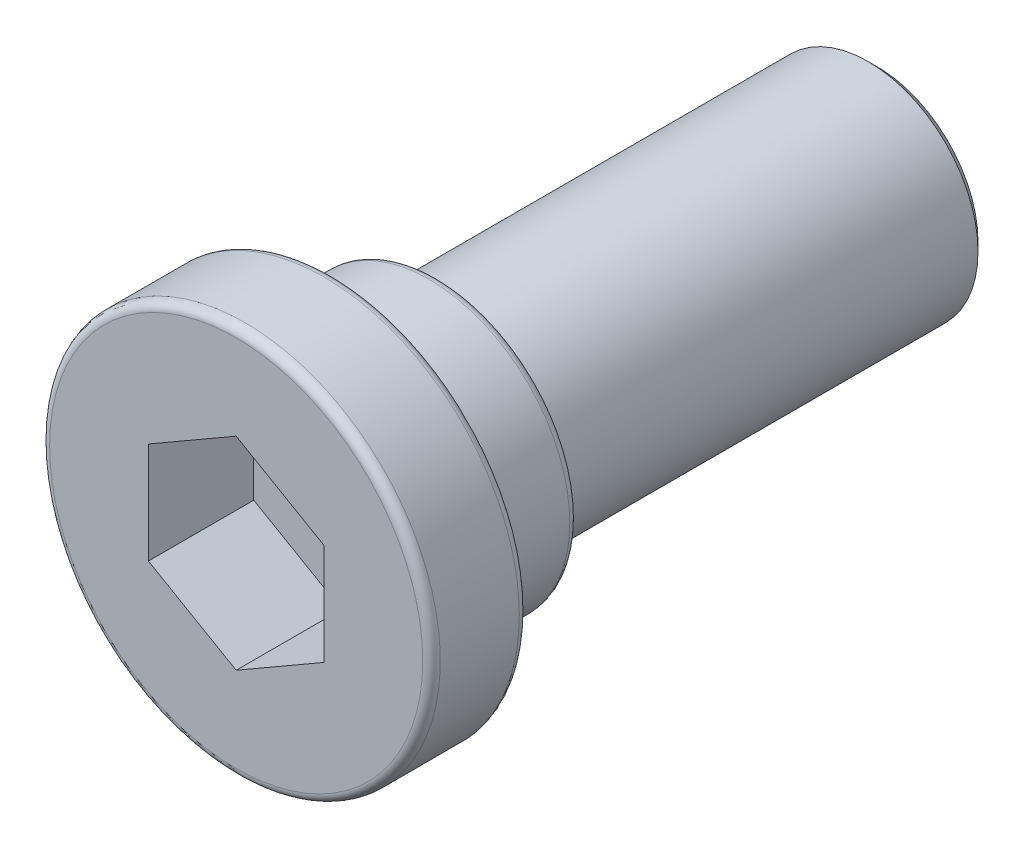
ISO-10303-21;
HEADER;
FILE_DESCRIPTION(('STEP AP214'),'2;1');
FILE_NAME('part.step','',(''),(''),'','','');
FILE_SCHEMA(('AUTOMOTIVE_DESIGN { 1 0 10303 214 1 1 1 1 }'));
ENDSEC;
DATA;
#1=APPLICATION_CONTEXT('core data for automotive mechanical design processes');
#2=APPLICATION_PROTOCOL_DEFINITION('international standard','automotive_design',2000,#1);
#3=PRODUCT_CONTEXT('',#1,'mechanical');
#4=PRODUCT('Part','Part','',(#3));
#5=PRODUCT_RELATED_PRODUCT_CATEGORY('part','',(#4));
#6=PRODUCT_DEFINITION_FORMATION('','',#4);
#7=PRODUCT_DEFINITION_CONTEXT('part definition',#1,'design');
#8=PRODUCT_DEFINITION('design','',#6,#7);
#9=PRODUCT_DEFINITION_SHAPE('','',#8);
#10=(LENGTH_UNIT() NAMED_UNIT(*) SI_UNIT(.MILLI.,.METRE.));
#11=(NAMED_UNIT(*) PLANE_ANGLE_UNIT() SI_UNIT($,.RADIAN.));
#12=(NAMED_UNIT(*) SI_UNIT($,.STERADIAN.) SOLID_ANGLE_UNIT());
#13=UNCERTAINTY_MEASURE_WITH_UNIT(LENGTH_MEASURE(1.E-05),#10,'distance_accuracy_value','');
#14=(GEOMETRIC_REPRESENTATION_CONTEXT(3) GLOBAL_UNCERTAINTY_ASSIGNED_CONTEXT((#13)) GLOBAL_UNIT_ASSIGNED_CONTEXT((#10,
#11,#12)) REPRESENTATION_CONTEXT('',''));
#15=CARTESIAN_POINT('',(0.,0.,0.));
#16=DIRECTION('',(0.,0.,1.));
#17=DIRECTION('',(1.,0.,0.));
#18=AXIS2_PLACEMENT_3D('',#15,#16,#17);
#19=CARTESIAN_POINT('',(0.,0.,6.1));
#20=DIRECTION('',(0.,0.,1.));
#21=DIRECTION('',(1.,0.,0.));
#22=AXIS2_PLACEMENT_3D('',#19,#20,#21);
#23=PLANE('',#22);
#24=DIRECTION('',(0.866025403784439,0.5,0.));
#25=VECTOR('',#24,1.);
#26=CARTESIAN_POINT('',(0.,-1.15470053837925,6.1));
#27=LINE('',#26,#25);
#28=CARTESIAN_POINT('',(0.,-1.15470053837925,6.1));
#29=VERTEX_POINT('',#28);
#30=CARTESIAN_POINT('',(1.,-0.577350269189626,6.1));
#31=VERTEX_POINT('',#30);
#32=EDGE_CURVE('E105',#29,#31,#27,.T.);
#33=ORIENTED_EDGE('',*,*,#32,.T.);
#34=DIRECTION('',(0.,1.,0.));
#35=VECTOR('',#34,1.);
#36=CARTESIAN_POINT('',(1.,-0.577350269189626,6.1));
#37=LINE('',#36,#35);
#38=CARTESIAN_POINT('',(1.,0.577350269189626,6.1));
#39=VERTEX_POINT('',#38);
#40=EDGE_CURVE('E108',#31,#39,#37,.T.);
#41=ORIENTED_EDGE('',*,*,#40,.T.);
#42=DIRECTION('',(-0.866025403784439,0.5,0.));
#43=VECTOR('',#42,1.);
#44=CARTESIAN_POINT('',(1.,0.577350269189626,6.1));
#45=LINE('',#44,#43);
#46=CARTESIAN_POINT('',(0.,1.15470053837925,6.1));
#47=VERTEX_POINT('',#46);
#48=EDGE_CURVE('E110',#39,#47,#45,.T.);
#49=ORIENTED_EDGE('',*,*,#48,.T.);
#50=DIRECTION('',(-0.866025403784439,-0.5,0.));
#51=VECTOR('',#50,1.);
#52=CARTESIAN_POINT('',(0.,1.15470053837925,6.1));
#53=LINE('',#52,#51);
#54=CARTESIAN_POINT('',(-1.,0.577350269189626,6.1));
#55=VERTEX_POINT('',#54);
#56=EDGE_CURVE('E273',#47,#55,#53,.T.);
#57=ORIENTED_EDGE('',*,*,#56,.T.);
#58=DIRECTION('',(0.,-1.,0.));
#59=VECTOR('',#58,1.);
#60=CARTESIAN_POINT('',(-1.,0.577350269189626,6.1));
#61=LINE('',#60,#59);
#62=CARTESIAN_POINT('',(-1.,-0.577350269189626,6.1));
#63=VERTEX_POINT('',#62);
#64=EDGE_CURVE('E281',#55,#63,#61,.T.);
#65=ORIENTED_EDGE('',*,*,#64,.T.);
#66=DIRECTION('',(0.866025403784439,-0.5,0.));
#67=VECTOR('',#66,1.);
#68=CARTESIAN_POINT('',(-1.,-0.577350269189626,6.1));
#69=LINE('',#68,#67);
#70=EDGE_CURVE('E287',#63,#29,#69,.T.);
#71=ORIENTED_EDGE('',*,*,#70,.T.);
#72=EDGE_LOOP('',(#33,#41,#49,#57,#65,#71));
#73=FACE_BOUND('',#72,.T.);
#74=ADVANCED_FACE('F16',(#73),#23,.T.);
#75=CARTESIAN_POINT('',(1.,0.577350269189626,6.1));
#76=DIRECTION('',(0.5,0.866025403784439,0.));
#77=DIRECTION('',(-0.866025403784439,0.5,0.));
#78=AXIS2_PLACEMENT_3D('',#75,#76,#77);
#79=PLANE('',#78);
#80=DIRECTION('',(0.,0.,1.));
#81=VECTOR('',#80,1.);
#82=CARTESIAN_POINT('',(0.,1.15470053837925,6.1));
#83=LINE('',#82,#81);
#84=CARTESIAN_POINT('',(0.,1.15470053837925,7.3));
#85=VERTEX_POINT('',#84);
#86=EDGE_CURVE('E122',#85,#47,#83,.F.);
#87=ORIENTED_EDGE('',*,*,#86,.T.);
#88=ORIENTED_EDGE('',*,*,#48,.F.);
#89=DIRECTION('',(0.,0.,1.));
#90=VECTOR('',#89,1.);
#91=CARTESIAN_POINT('',(1.,0.577350269189626,6.1));
#92=LINE('',#91,#90);
#93=CARTESIAN_POINT('',(1.,0.577350269189626,7.3));
#94=VERTEX_POINT('',#93);
#95=EDGE_CURVE('E116',#39,#94,#92,.T.);
#96=ORIENTED_EDGE('',*,*,#95,.T.);
#97=DIRECTION('',(0.866025403784438,-0.5,0.));
#98=VECTOR('',#97,1.);
#99=CARTESIAN_POINT('',(0.,1.15470053837925,7.3));
#100=LINE('',#99,#98);
#101=EDGE_CURVE('E272',#85,#94,#100,.T.);
#102=ORIENTED_EDGE('',*,*,#101,.F.);
#103=EDGE_LOOP('',(#87,#88,#96,#102));
#104=FACE_BOUND('',#103,.T.);
#105=ADVANCED_FACE('F119',(#104),#79,.F.);
#106=CARTESIAN_POINT('',(1.,-0.577350269189626,6.1));
#107=DIRECTION('',(1.,0.,0.));
#108=DIRECTION('',(0.,1.,0.));
#109=AXIS2_PLACEMENT_3D('',#106,#107,#108);
#110=PLANE('',#109);
#111=ORIENTED_EDGE('',*,*,#95,.F.);
#112=ORIENTED_EDGE('',*,*,#40,.F.);
#113=DIRECTION('',(0.,0.,1.));
#114=VECTOR('',#113,1.);
#115=CARTESIAN_POINT('',(1.,-0.577350269189626,6.1));
#116=LINE('',#115,#114);
#117=CARTESIAN_POINT('',(1.,-0.577350269189626,7.3));
#118=VERTEX_POINT('',#117);
#119=EDGE_CURVE('E135',#31,#118,#116,.T.);
#120=ORIENTED_EDGE('',*,*,#119,.T.);
#121=DIRECTION('',(0.,1.,0.));
#122=VECTOR('',#121,1.);
#123=CARTESIAN_POINT('',(1.,0.,7.3));
#124=LINE('',#123,#122);
#125=EDGE_CURVE('E128',#94,#118,#124,.F.);
#126=ORIENTED_EDGE('',*,*,#125,.F.);
#127=EDGE_LOOP('',(#111,#112,#120,#126));
#128=FACE_BOUND('',#127,.T.);
#129=ADVANCED_FACE('F126',(#128),#110,.F.);
#130=CARTESIAN_POINT('',(0.,-1.15470053837925,6.1));
#131=DIRECTION('',(0.5,-0.866025403784439,0.));
#132=DIRECTION('',(0.866025403784439,0.5,0.));
#133=AXIS2_PLACEMENT_3D('',#130,#131,#132);
#134=PLANE('',#133);
#135=ORIENTED_EDGE('',*,*,#119,.F.);
#136=ORIENTED_EDGE('',*,*,#32,.F.);
#137=DIRECTION('',(0.,0.,1.));
#138=VECTOR('',#137,1.);
#139=CARTESIAN_POINT('',(0.,-1.15470053837925,6.1));
#140=LINE('',#139,#138);
#141=CARTESIAN_POINT('',(0.,-1.15470053837925,7.3));
#142=VERTEX_POINT('',#141);
#143=EDGE_CURVE('E284',#29,#142,#140,.T.);
#144=ORIENTED_EDGE('',*,*,#143,.T.);
#145=DIRECTION('',(-0.866025403784439,-0.5,0.));
#146=VECTOR('',#145,1.);
#147=CARTESIAN_POINT('',(1.,-0.577350269189626,7.3));
#148=LINE('',#147,#146);
#149=EDGE_CURVE('E294',#118,#142,#148,.T.);
#150=ORIENTED_EDGE('',*,*,#149,.F.);
#151=EDGE_LOOP('',(#135,#136,#144,#150));
#152=FACE_BOUND('',#151,.T.);
#153=ADVANCED_FACE('F295',(#152),#134,.F.);
#154=CARTESIAN_POINT('',(-1.,-0.577350269189626,6.1));
#155=DIRECTION('',(-0.5,-0.866025403784439,0.));
#156=DIRECTION('',(0.866025403784439,-0.5,0.));
#157=AXIS2_PLACEMENT_3D('',#154,#155,#156);
#158=PLANE('',#157);
#159=ORIENTED_EDGE('',*,*,#143,.F.);
#160=ORIENTED_EDGE('',*,*,#70,.F.);
#161=DIRECTION('',(0.,0.,1.));
#162=VECTOR('',#161,1.);
#163=CARTESIAN_POINT('',(-1.,-0.577350269189626,6.1));
#164=LINE('',#163,#162);
#165=CARTESIAN_POINT('',(-1.,-0.577350269189626,7.3));
#166=VERTEX_POINT('',#165);
#167=EDGE_CURVE('E278',#63,#166,#164,.T.);
#168=ORIENTED_EDGE('',*,*,#167,.T.);
#169=DIRECTION('',(-0.866025403784439,0.5,0.));
#170=VECTOR('',#169,1.);
#171=CARTESIAN_POINT('',(0.,-1.15470053837925,7.3));
#172=LINE('',#171,#170);
#173=EDGE_CURVE('E301',#142,#166,#172,.T.);
#174=ORIENTED_EDGE('',*,*,#173,.F.);
#175=EDGE_LOOP('',(#159,#160,#168,#174));
#176=FACE_BOUND('',#175,.T.);
#177=ADVANCED_FACE('F444',(#176),#158,.F.);
#178=CARTESIAN_POINT('',(-1.,0.577350269189626,6.1));
#179=DIRECTION('',(-1.,0.,0.));
#180=DIRECTION('',(0.,-1.,0.));
#181=AXIS2_PLACEMENT_3D('',#178,#179,#180);
#182=PLANE('',#181);
#183=ORIENTED_EDGE('',*,*,#167,.F.);
#184=ORIENTED_EDGE('',*,*,#64,.F.);
#185=DIRECTION('',(0.,0.,1.));
#186=VECTOR('',#185,1.);
#187=CARTESIAN_POINT('',(-1.,0.577350269189626,6.1));
#188=LINE('',#187,#186);
#189=CARTESIAN_POINT('',(-1.,0.577350269189626,7.3));
#190=VERTEX_POINT('',#189);
#191=EDGE_CURVE('E264',#55,#190,#188,.T.);
#192=ORIENTED_EDGE('',*,*,#191,.T.);
#193=DIRECTION('',(0.,1.,0.));
#194=VECTOR('',#193,1.);
#195=CARTESIAN_POINT('',(-1.,0.,7.3));
#196=LINE('',#195,#194);
#197=EDGE_CURVE('E313',#166,#190,#196,.T.);
#198=ORIENTED_EDGE('',*,*,#197,.F.);
#199=EDGE_LOOP('',(#183,#184,#192,#198));
#200=FACE_BOUND('',#199,.T.);
#201=ADVANCED_FACE('F437',(#200),#182,.F.);
#202=CARTESIAN_POINT('',(0.,1.15470053837925,6.1));
#203=DIRECTION('',(-0.5,0.866025403784439,0.));
#204=DIRECTION('',(-0.866025403784439,-0.5,0.));
#205=AXIS2_PLACEMENT_3D('',#202,#203,#204);
#206=PLANE('',#205);
#207=ORIENTED_EDGE('',*,*,#191,.F.);
#208=ORIENTED_EDGE('',*,*,#56,.F.);
#209=ORIENTED_EDGE('',*,*,#86,.F.);
#210=DIRECTION('',(0.866025403784438,0.5,0.));
#211=VECTOR('',#210,1.);
#212=CARTESIAN_POINT('',(-1.,0.577350269189626,7.3));
#213=LINE('',#212,#211);
#214=EDGE_CURVE('E315',#190,#85,#213,.T.);
#215=ORIENTED_EDGE('',*,*,#214,.F.);
#216=EDGE_LOOP('',(#207,#208,#209,#215));
#217=FACE_BOUND('',#216,.T.);
#218=ADVANCED_FACE('F431',(#217),#206,.F.);
#219=CARTESIAN_POINT('',(0.,0.,7.3));
#220=DIRECTION('',(0.,0.,1.));
#221=DIRECTION('',(1.,0.,0.));
#222=AXIS2_PLACEMENT_3D('',#219,#220,#221);
#223=PLANE('',#222);
#224=ORIENTED_EDGE('',*,*,#197,.T.);
#225=ORIENTED_EDGE('',*,*,#214,.T.);
#226=ORIENTED_EDGE('',*,*,#101,.T.);
#227=ORIENTED_EDGE('',*,*,#125,.T.);
#228=ORIENTED_EDGE('',*,*,#149,.T.);
#229=ORIENTED_EDGE('',*,*,#173,.T.);
#230=EDGE_LOOP('',(#224,#225,#226,#227,#228,#229));
#231=FACE_BOUND('',#230,.T.);
#232=CARTESIAN_POINT('',(0.,0.,7.3));
#233=DIRECTION('',(0.,0.,-1.));
#234=DIRECTION('',(-1.,0.,0.));
#235=AXIS2_PLACEMENT_3D('',#232,#233,#234);
#236=CIRCLE('',#235,2.125);
#237=CARTESIAN_POINT('',(-2.125,0.,7.3));
#238=VERTEX_POINT('',#237);
#239=CARTESIAN_POINT('',(2.125,0.,7.3));
#240=VERTEX_POINT('',#239);
#241=EDGE_CURVE('E318',#238,#240,#236,.T.);
#242=ORIENTED_EDGE('',*,*,#241,.F.);
#243=CARTESIAN_POINT('',(0.,0.,7.3));
#244=DIRECTION('',(0.,0.,-1.));
#245=DIRECTION('',(1.,0.,0.));
#246=AXIS2_PLACEMENT_3D('',#243,#244,#245);
#247=CIRCLE('',#246,2.125);
#248=EDGE_CURVE('E243',#240,#238,#247,.T.);
#249=ORIENTED_EDGE('',*,*,#248,.F.);
#250=EDGE_LOOP('',(#242,#249));
#251=FACE_BOUND('',#250,.T.);
#252=ADVANCED_FACE('F252',(#231,#251),#223,.T.);
#253=CARTESIAN_POINT('',(0.,0.,7.2));
#254=DIRECTION('',(0.,0.,1.));
#255=DIRECTION('',(1.,0.,0.));
#256=AXIS2_PLACEMENT_3D('',#253,#254,#255);
#257=TOROIDAL_SURFACE('',#256,2.125,0.1);
#258=CARTESIAN_POINT('',(0.,0.,7.2));
#259=DIRECTION('',(0.,0.,-1.));
#260=DIRECTION('',(-1.,0.,0.));
#261=AXIS2_PLACEMENT_3D('',#258,#259,#260);
#262=CIRCLE('',#261,2.225);
#263=CARTESIAN_POINT('',(-2.225,0.,7.2));
#264=VERTEX_POINT('',#263);
#265=EDGE_CURVE('E239',#264,#264,#262,.T.);
#266=ORIENTED_EDGE('',*,*,#265,.F.);
#267=EDGE_LOOP('',(#266));
#268=FACE_BOUND('',#267,.T.);
#269=ORIENTED_EDGE('',*,*,#248,.T.);
#270=ORIENTED_EDGE('',*,*,#241,.T.);
#271=EDGE_LOOP('',(#269,#270));
#272=FACE_BOUND('',#271,.T.);
#273=ADVANCED_FACE('F247',(#268,#272),#257,.T.);
#274=CARTESIAN_POINT('',(0.,0.,7.3));
#275=DIRECTION('',(0.,0.,-1.));
#276=DIRECTION('',(-1.,0.,0.));
#277=AXIS2_PLACEMENT_3D('',#274,#275,#276);
#278=CYLINDRICAL_SURFACE('',#277,2.225);
#279=ORIENTED_EDGE('',*,*,#265,.T.);
#280=EDGE_LOOP('',(#279));
#281=FACE_BOUND('',#280,.T.);
#282=CARTESIAN_POINT('',(0.,0.,6.3));
#283=DIRECTION('',(0.,0.,1.));
#284=DIRECTION('',(1.,0.,0.));
#285=AXIS2_PLACEMENT_3D('',#282,#283,#284);
#286=CIRCLE('',#285,2.225);
#287=CARTESIAN_POINT('',(2.225,0.,6.3));
#288=VERTEX_POINT('',#287);
#289=EDGE_CURVE('E230',#288,#288,#286,.F.);
#290=ORIENTED_EDGE('',*,*,#289,.F.);
#291=EDGE_LOOP('',(#290));
#292=FACE_BOUND('',#291,.T.);
#293=ADVANCED_FACE('F251',(#281,#292),#278,.T.);
#294=CARTESIAN_POINT('',(0.,0.,6.3));
#295=DIRECTION('',(0.,0.,1.));
#296=DIRECTION('',(1.,0.,0.));
#297=AXIS2_PLACEMENT_3D('',#294,#295,#296);
#298=TOROIDAL_SURFACE('',#297,2.125,0.1);
#299=CARTESIAN_POINT('',(0.,0.,6.2));
#300=DIRECTION('',(0.,0.,1.));
#301=DIRECTION('',(1.,0.,0.));
#302=AXIS2_PLACEMENT_3D('',#299,#300,#301);
#303=CIRCLE('',#302,2.125);
#304=CARTESIAN_POINT('',(2.125,0.,6.2));
#305=VERTEX_POINT('',#304);
#306=CARTESIAN_POINT('',(-2.125,0.,6.2));
#307=VERTEX_POINT('',#306);
#308=EDGE_CURVE('E196',#305,#307,#303,.T.);
#309=ORIENTED_EDGE('',*,*,#308,.T.);
#310=CARTESIAN_POINT('',(0.,0.,6.2));
#311=DIRECTION('',(0.,0.,1.));
#312=DIRECTION('',(-1.,0.,0.));
#313=AXIS2_PLACEMENT_3D('',#310,#311,#312);
#314=CIRCLE('',#313,2.125);
#315=EDGE_CURVE('E151',#307,#305,#314,.T.);
#316=ORIENTED_EDGE('',*,*,#315,.T.);
#317=EDGE_LOOP('',(#309,#316));
#318=FACE_BOUND('',#317,.T.);
#319=ORIENTED_EDGE('',*,*,#289,.T.);
#320=EDGE_LOOP('',(#319));
#321=FACE_BOUND('',#320,.T.);
#322=ADVANCED_FACE('F210',(#318,#321),#298,.T.);
#323=CARTESIAN_POINT('',(0.,0.,6.2));
#324=DIRECTION('',(0.,0.,1.));
#325=DIRECTION('',(1.,0.,0.));
#326=AXIS2_PLACEMENT_3D('',#323,#324,#325);
#327=PLANE('',#326);
#328=CARTESIAN_POINT('',(0.,0.,6.2));
#329=DIRECTION('',(0.,0.,-1.));
#330=DIRECTION('',(-1.,0.,0.));
#331=AXIS2_PLACEMENT_3D('',#328,#329,#330);
#332=CIRCLE('',#331,1.6);
#333=CARTESIAN_POINT('',(-1.6,0.,6.2));
#334=VERTEX_POINT('',#333);
#335=EDGE_CURVE('E147',#334,#334,#332,.T.);
#336=ORIENTED_EDGE('',*,*,#335,.F.);
#337=EDGE_LOOP('',(#336));
#338=FACE_BOUND('',#337,.T.);
#339=ORIENTED_EDGE('',*,*,#308,.F.);
#340=ORIENTED_EDGE('',*,*,#315,.F.);
#341=EDGE_LOOP('',(#339,#340));
#342=FACE_BOUND('',#341,.T.);
#343=ADVANCED_FACE('F201',(#338,#342),#327,.F.);
#344=CARTESIAN_POINT('',(0.,0.,6.2));
#345=DIRECTION('',(0.,0.,-1.));
#346=DIRECTION('',(-1.,0.,0.));
#347=AXIS2_PLACEMENT_3D('',#344,#345,#346);
#348=CYLINDRICAL_SURFACE('',#347,1.6);
#349=ORIENTED_EDGE('',*,*,#335,.T.);
#350=EDGE_LOOP('',(#349));
#351=FACE_BOUND('',#350,.T.);
#352=CARTESIAN_POINT('',(0.,0.,5.1));
#353=DIRECTION('',(0.,0.,1.));
#354=DIRECTION('',(1.,0.,0.));
#355=AXIS2_PLACEMENT_3D('',#352,#353,#354);
#356=CIRCLE('',#355,1.6);
#357=CARTESIAN_POINT('',(1.6,0.,5.1));
#358=VERTEX_POINT('',#357);
#359=EDGE_CURVE('E150',#358,#358,#356,.F.);
#360=ORIENTED_EDGE('',*,*,#359,.F.);
#361=EDGE_LOOP('',(#360));
#362=FACE_BOUND('',#361,.T.);
#363=ADVANCED_FACE('F170',(#351,#362),#348,.T.);
#364=CARTESIAN_POINT('',(0.,0.,5.1));
#365=DIRECTION('',(0.,0.,1.));
#366=DIRECTION('',(1.,0.,0.));
#367=AXIS2_PLACEMENT_3D('',#364,#365,#366);
#368=TOROIDAL_SURFACE('',#367,1.5,0.1);
#369=CARTESIAN_POINT('',(0.,0.,5.));
#370=DIRECTION('',(0.,0.,1.));
#371=DIRECTION('',(1.,0.,0.));
#372=AXIS2_PLACEMENT_3D('',#369,#370,#371);
#373=CIRCLE('',#372,1.5);
#374=CARTESIAN_POINT('',(1.5,0.,5.));
#375=VERTEX_POINT('',#374);
#376=CARTESIAN_POINT('',(-1.5,0.,5.));
#377=VERTEX_POINT('',#376);
#378=EDGE_CURVE('E40',#375,#377,#373,.T.);
#379=ORIENTED_EDGE('',*,*,#378,.T.);
#380=CARTESIAN_POINT('',(0.,0.,5.));
#381=DIRECTION('',(0.,0.,1.));
#382=DIRECTION('',(-1.,0.,0.));
#383=AXIS2_PLACEMENT_3D('',#380,#381,#382);
#384=CIRCLE('',#383,1.5);
#385=EDGE_CURVE('E146',#377,#375,#384,.T.);
#386=ORIENTED_EDGE('',*,*,#385,.T.);
#387=EDGE_LOOP('',(#379,#386));
#388=FACE_BOUND('',#387,.T.);
#389=ORIENTED_EDGE('',*,*,#359,.T.);
#390=EDGE_LOOP('',(#389));
#391=FACE_BOUND('',#390,.T.);
#392=ADVANCED_FACE('F158',(#388,#391),#368,.T.);
#393=CARTESIAN_POINT('',(0.,0.,0.));
#394=DIRECTION('',(0.,0.,1.));
#395=DIRECTION('',(1.,0.,0.));
#396=AXIS2_PLACEMENT_3D('',#393,#394,#395);
#397=PLANE('',#396);
#398=CARTESIAN_POINT('',(0.,0.,0.));
#399=DIRECTION('',(0.,0.,1.));
#400=DIRECTION('',(1.,0.,0.));
#401=AXIS2_PLACEMENT_3D('',#398,#399,#400);
#402=CIRCLE('',#401,1.14999999999554);
#403=CARTESIAN_POINT('',(1.14999999999554,0.,0.));
#404=VERTEX_POINT('',#403);
#405=EDGE_CURVE('E142',#404,#404,#402,.T.);
#406=ORIENTED_EDGE('',*,*,#405,.F.);
#407=EDGE_LOOP('',(#406));
#408=FACE_BOUND('',#407,.T.);
#409=ADVANCED_FACE('F169',(#408),#397,.F.);
#410=CARTESIAN_POINT('',(0.,0.,5.));
#411=DIRECTION('',(0.,0.,1.));
#412=DIRECTION('',(1.,0.,0.));
#413=AXIS2_PLACEMENT_3D('',#410,#411,#412);
#414=PLANE('',#413);
#415=CARTESIAN_POINT('',(0.,0.,5.));
#416=DIRECTION('',(0.,0.,-1.));
#417=DIRECTION('',(-1.,0.,0.));
#418=AXIS2_PLACEMENT_3D('',#415,#416,#417);
#419=CIRCLE('',#418,1.25);
#420=CARTESIAN_POINT('',(-1.25,0.,5.));
#421=VERTEX_POINT('',#420);
#422=EDGE_CURVE('E28',#421,#421,#419,.T.);
#423=ORIENTED_EDGE('',*,*,#422,.F.);
#424=EDGE_LOOP('',(#423));
#425=FACE_BOUND('',#424,.T.);
#426=ORIENTED_EDGE('',*,*,#378,.F.);
#427=ORIENTED_EDGE('',*,*,#385,.F.);
#428=EDGE_LOOP('',(#426,#427));
#429=FACE_BOUND('',#428,.T.);
#430=ADVANCED_FACE('F366',(#425,#429),#414,.F.);
#431=CARTESIAN_POINT('',(0.,0.,0.100000000031741));
#432=DIRECTION('',(0.,0.,1.));
#433=DIRECTION('',(1.,0.,0.));
#434=AXIS2_PLACEMENT_3D('',#431,#432,#433);
#435=CONICAL_SURFACE('',#434,1.25000000002728,0.785398163397448);
#436=CARTESIAN_POINT('',(0.,0.,0.100000000000001));
#437=DIRECTION('',(0.,0.,-1.));
#438=DIRECTION('',(-1.,0.,0.));
#439=AXIS2_PLACEMENT_3D('',#436,#437,#438);
#440=CIRCLE('',#439,1.25);
#441=CARTESIAN_POINT('',(-1.25,0.,0.100000000000001));
#442=VERTEX_POINT('',#441);
#443=EDGE_CURVE('E11',#442,#442,#440,.F.);
#444=ORIENTED_EDGE('',*,*,#443,.F.);
#445=EDGE_LOOP('',(#444));
#446=FACE_BOUND('',#445,.T.);
#447=ORIENTED_EDGE('',*,*,#405,.T.);
#448=EDGE_LOOP('',(#447));
#449=FACE_BOUND('',#448,.T.);
#450=ADVANCED_FACE('F360',(#446,#449),#435,.T.);
#451=CARTESIAN_POINT('',(0.,0.,5.));
#452=DIRECTION('',(0.,0.,-1.));
#453=DIRECTION('',(-1.,0.,0.));
#454=AXIS2_PLACEMENT_3D('',#451,#452,#453);
#455=CYLINDRICAL_SURFACE('',#454,1.25);
#456=ORIENTED_EDGE('',*,*,#443,.T.);
#457=EDGE_LOOP('',(#456));
#458=FACE_BOUND('',#457,.T.);
#459=ORIENTED_EDGE('',*,*,#422,.T.);
#460=EDGE_LOOP('',(#459));
#461=FACE_BOUND('',#460,.T.);
#462=ADVANCED_FACE('F358',(#458,#461),#455,.T.);
#463=CLOSED_SHELL('',(#74,#105,#129,#153,#177,#201,#218,#252,#273,#293,#322,#343,#363,#392,#409,
#430,#450,#462));
#464=MANIFOLD_SOLID_BREP('B1',#463);
#465=ADVANCED_BREP_SHAPE_REPRESENTATION('',(#18,#464),#14);
#466=SHAPE_DEFINITION_REPRESENTATION(#9,#465);
ENDSEC;
END-ISO-10303-21;
